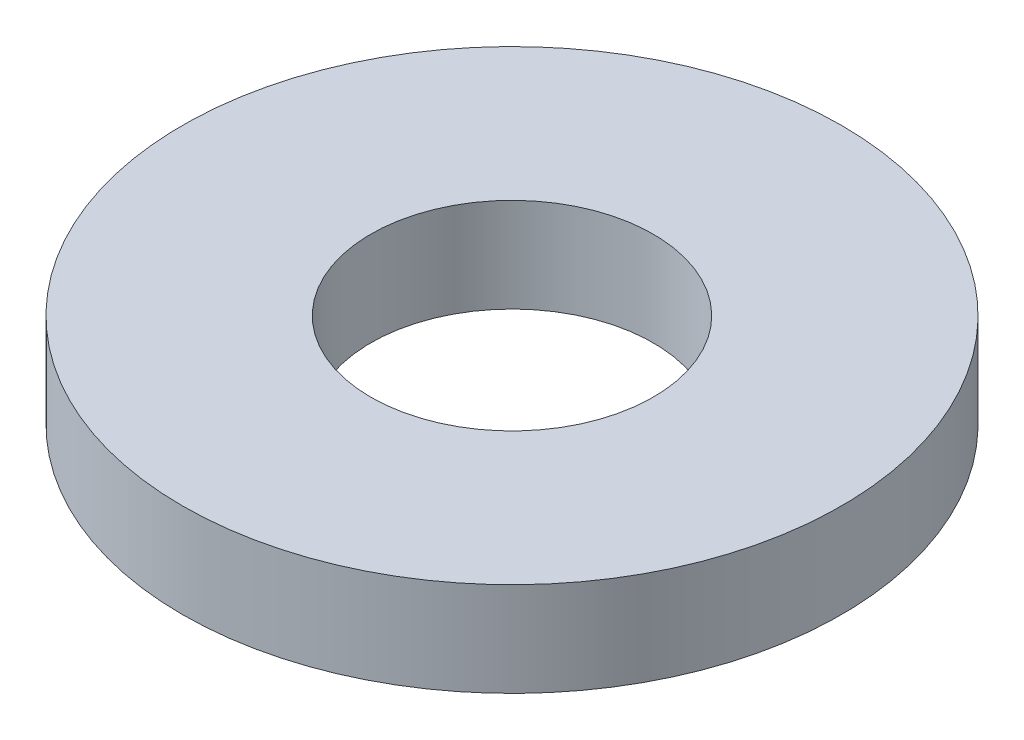
ISO-10303-21;
HEADER;
FILE_DESCRIPTION(('STEP AP214'),'2;1');
FILE_NAME('part.step','',(''),(''),'','','');
FILE_SCHEMA(('AUTOMOTIVE_DESIGN { 1 0 10303 214 1 1 1 1 }'));
ENDSEC;
DATA;
#1=APPLICATION_CONTEXT('core data for automotive mechanical design processes');
#2=APPLICATION_PROTOCOL_DEFINITION('international standard','automotive_design',2000,#1);
#3=PRODUCT_CONTEXT('',#1,'mechanical');
#4=PRODUCT('Part','Part','',(#3));
#5=PRODUCT_RELATED_PRODUCT_CATEGORY('part','',(#4));
#6=PRODUCT_DEFINITION_FORMATION('','',#4);
#7=PRODUCT_DEFINITION_CONTEXT('part definition',#1,'design');
#8=PRODUCT_DEFINITION('design','',#6,#7);
#9=PRODUCT_DEFINITION_SHAPE('','',#8);
#10=(LENGTH_UNIT() NAMED_UNIT(*) SI_UNIT(.MILLI.,.METRE.));
#11=(NAMED_UNIT(*) PLANE_ANGLE_UNIT() SI_UNIT($,.RADIAN.));
#12=(NAMED_UNIT(*) SI_UNIT($,.STERADIAN.) SOLID_ANGLE_UNIT());
#13=UNCERTAINTY_MEASURE_WITH_UNIT(LENGTH_MEASURE(1.E-05),#10,'distance_accuracy_value','');
#14=(GEOMETRIC_REPRESENTATION_CONTEXT(3) GLOBAL_UNCERTAINTY_ASSIGNED_CONTEXT((#13)) GLOBAL_UNIT_ASSIGNED_CONTEXT((#10,
#11,#12)) REPRESENTATION_CONTEXT('',''));
#15=CARTESIAN_POINT('',(0.,0.,0.));
#16=DIRECTION('',(0.,0.,1.));
#17=DIRECTION('',(1.,0.,0.));
#18=AXIS2_PLACEMENT_3D('',#15,#16,#17);
#19=CARTESIAN_POINT('',(0.,2.,0.));
#20=DIRECTION('',(0.,1.,0.));
#21=DIRECTION('',(0.,0.,1.));
#22=AXIS2_PLACEMENT_3D('',#19,#20,#21);
#23=PLANE('',#22);
#24=CARTESIAN_POINT('',(0.,2.,0.));
#25=DIRECTION('',(0.,1.,0.));
#26=DIRECTION('',(0.,0.,1.));
#27=AXIS2_PLACEMENT_3D('',#24,#25,#26);
#28=CIRCLE('',#27,7.);
#29=CARTESIAN_POINT('',(0.,2.,7.));
#30=VERTEX_POINT('',#29);
#31=EDGE_CURVE('E10',#30,#30,#28,.T.);
#32=ORIENTED_EDGE('',*,*,#31,.T.);
#33=EDGE_LOOP('',(#32));
#34=FACE_BOUND('',#33,.T.);
#35=CARTESIAN_POINT('',(0.,2.,0.));
#36=DIRECTION('',(0.,1.,0.));
#37=DIRECTION('',(0.,0.,1.));
#38=AXIS2_PLACEMENT_3D('',#35,#36,#37);
#39=CIRCLE('',#38,3.);
#40=CARTESIAN_POINT('',(0.,2.,3.));
#41=VERTEX_POINT('',#40);
#42=EDGE_CURVE('E44',#41,#41,#39,.T.);
#43=ORIENTED_EDGE('',*,*,#42,.F.);
#44=EDGE_LOOP('',(#43));
#45=FACE_BOUND('',#44,.T.);
#46=ADVANCED_FACE('F33',(#34,#45),#23,.T.);
#47=CARTESIAN_POINT('',(0.,0.,0.));
#48=DIRECTION('',(0.,1.,0.));
#49=DIRECTION('',(0.,0.,1.));
#50=AXIS2_PLACEMENT_3D('',#47,#48,#49);
#51=PLANE('',#50);
#52=CARTESIAN_POINT('',(0.,0.,0.));
#53=DIRECTION('',(0.,1.,0.));
#54=DIRECTION('',(0.,0.,1.));
#55=AXIS2_PLACEMENT_3D('',#52,#53,#54);
#56=CIRCLE('',#55,7.);
#57=CARTESIAN_POINT('',(0.,0.,7.));
#58=VERTEX_POINT('',#57);
#59=EDGE_CURVE('E37',#58,#58,#56,.T.);
#60=ORIENTED_EDGE('',*,*,#59,.F.);
#61=EDGE_LOOP('',(#60));
#62=FACE_BOUND('',#61,.T.);
#63=CARTESIAN_POINT('',(0.,0.,0.));
#64=DIRECTION('',(0.,1.,0.));
#65=DIRECTION('',(0.,0.,1.));
#66=AXIS2_PLACEMENT_3D('',#63,#64,#65);
#67=CIRCLE('',#66,3.);
#68=CARTESIAN_POINT('',(0.,0.,3.));
#69=VERTEX_POINT('',#68);
#70=EDGE_CURVE('E46',#69,#69,#67,.T.);
#71=ORIENTED_EDGE('',*,*,#70,.T.);
#72=EDGE_LOOP('',(#71));
#73=FACE_BOUND('',#72,.T.);
#74=ADVANCED_FACE('F56',(#62,#73),#51,.F.);
#75=CARTESIAN_POINT('',(0.,2.,0.));
#76=DIRECTION('',(0.,-1.,0.));
#77=DIRECTION('',(0.,0.,-1.));
#78=AXIS2_PLACEMENT_3D('',#75,#76,#77);
#79=CYLINDRICAL_SURFACE('',#78,7.);
#80=ORIENTED_EDGE('',*,*,#31,.F.);
#81=EDGE_LOOP('',(#80));
#82=FACE_BOUND('',#81,.T.);
#83=ORIENTED_EDGE('',*,*,#59,.T.);
#84=EDGE_LOOP('',(#83));
#85=FACE_BOUND('',#84,.T.);
#86=ADVANCED_FACE('F35',(#82,#85),#79,.T.);
#87=CARTESIAN_POINT('',(0.,2.,0.));
#88=DIRECTION('',(0.,-1.,0.));
#89=DIRECTION('',(0.,0.,-1.));
#90=AXIS2_PLACEMENT_3D('',#87,#88,#89);
#91=CYLINDRICAL_SURFACE('',#90,3.);
#92=ORIENTED_EDGE('',*,*,#42,.T.);
#93=EDGE_LOOP('',(#92));
#94=FACE_BOUND('',#93,.T.);
#95=ORIENTED_EDGE('',*,*,#70,.F.);
#96=EDGE_LOOP('',(#95));
#97=FACE_BOUND('',#96,.T.);
#98=ADVANCED_FACE('F52',(#94,#97),#91,.F.);
#99=CLOSED_SHELL('',(#46,#74,#86,#98));
#100=MANIFOLD_SOLID_BREP('B2',#99);
#101=ADVANCED_BREP_SHAPE_REPRESENTATION('',(#18,#100),#14);
#102=SHAPE_DEFINITION_REPRESENTATION(#9,#101);
ENDSEC;
END-ISO-10303-21;
